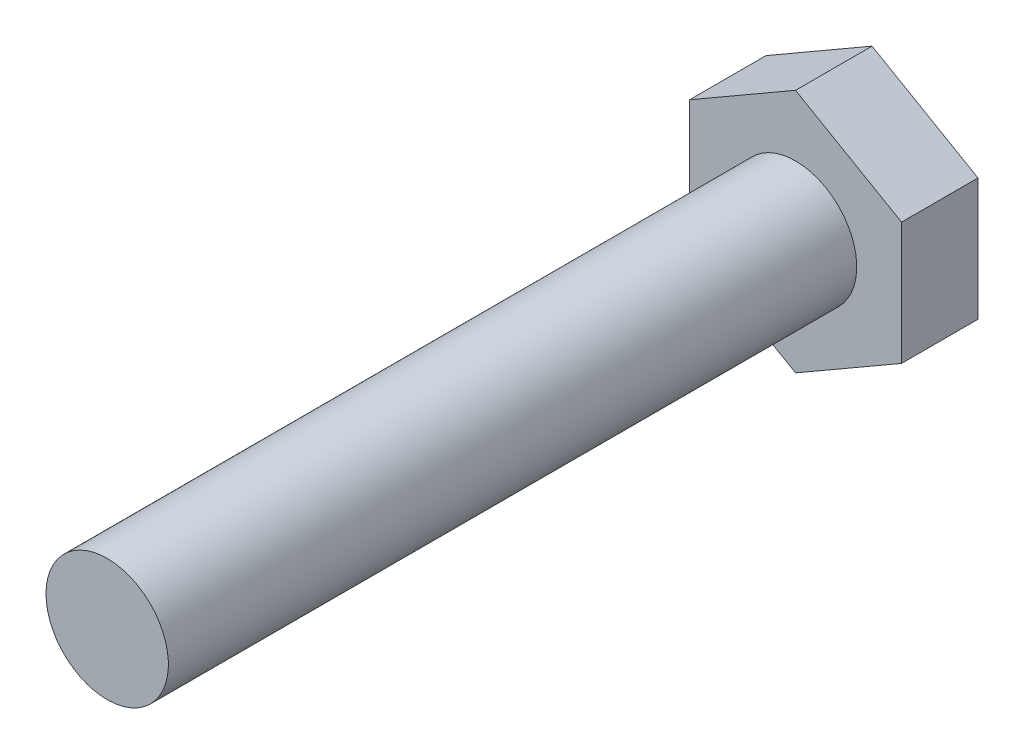
ISO-10303-21;
HEADER;
FILE_DESCRIPTION(('STEP AP214'),'2;1');
FILE_NAME('part.step','',(''),(''),'','','');
FILE_SCHEMA(('AUTOMOTIVE_DESIGN { 1 0 10303 214 1 1 1 1 }'));
ENDSEC;
DATA;
#1=APPLICATION_CONTEXT('core data for automotive mechanical design processes');
#2=APPLICATION_PROTOCOL_DEFINITION('international standard','automotive_design',2000,#1);
#3=PRODUCT_CONTEXT('',#1,'mechanical');
#4=PRODUCT('Part','Part','',(#3));
#5=PRODUCT_RELATED_PRODUCT_CATEGORY('part','',(#4));
#6=PRODUCT_DEFINITION_FORMATION('','',#4);
#7=PRODUCT_DEFINITION_CONTEXT('part definition',#1,'design');
#8=PRODUCT_DEFINITION('design','',#6,#7);
#9=PRODUCT_DEFINITION_SHAPE('','',#8);
#10=(LENGTH_UNIT() NAMED_UNIT(*) SI_UNIT(.MILLI.,.METRE.));
#11=(NAMED_UNIT(*) PLANE_ANGLE_UNIT() SI_UNIT($,.RADIAN.));
#12=(NAMED_UNIT(*) SI_UNIT($,.STERADIAN.) SOLID_ANGLE_UNIT());
#13=UNCERTAINTY_MEASURE_WITH_UNIT(LENGTH_MEASURE(1.E-05),#10,'distance_accuracy_value','');
#14=(GEOMETRIC_REPRESENTATION_CONTEXT(3) GLOBAL_UNCERTAINTY_ASSIGNED_CONTEXT((#13)) GLOBAL_UNIT_ASSIGNED_CONTEXT((#10,
#11,#12)) REPRESENTATION_CONTEXT('',''));
#15=CARTESIAN_POINT('',(0.,0.,0.));
#16=DIRECTION('',(0.,0.,1.));
#17=DIRECTION('',(1.,0.,0.));
#18=AXIS2_PLACEMENT_3D('',#15,#16,#17);
#19=CARTESIAN_POINT('',(13.856406460551,-8.,10.));
#20=DIRECTION('',(-1.,0.,0.));
#21=DIRECTION('',(0.,-1.,0.));
#22=AXIS2_PLACEMENT_3D('',#19,#20,#21);
#23=PLANE('',#22);
#24=DIRECTION('',(0.,1.,0.));
#25=VECTOR('',#24,1.);
#26=CARTESIAN_POINT('',(13.856406460551,-8.,0.));
#27=LINE('',#26,#25);
#28=CARTESIAN_POINT('',(13.856406460551,-8.,0.));
#29=VERTEX_POINT('',#28);
#30=CARTESIAN_POINT('',(13.856406460551,8.00000000000001,0.));
#31=VERTEX_POINT('',#30);
#32=EDGE_CURVE('E123',#29,#31,#27,.T.);
#33=ORIENTED_EDGE('',*,*,#32,.T.);
#34=DIRECTION('',(0.,0.,-1.));
#35=VECTOR('',#34,1.);
#36=CARTESIAN_POINT('',(13.856406460551,8.00000000000001,10.));
#37=LINE('',#36,#35);
#38=CARTESIAN_POINT('',(13.856406460551,8.00000000000001,10.));
#39=VERTEX_POINT('',#38);
#40=EDGE_CURVE('E40',#39,#31,#37,.T.);
#41=ORIENTED_EDGE('',*,*,#40,.F.);
#42=DIRECTION('',(0.,1.,0.));
#43=VECTOR('',#42,1.);
#44=CARTESIAN_POINT('',(13.856406460551,-8.,10.));
#45=LINE('',#44,#43);
#46=CARTESIAN_POINT('',(13.856406460551,-8.,10.));
#47=VERTEX_POINT('',#46);
#48=EDGE_CURVE('E134',#47,#39,#45,.T.);
#49=ORIENTED_EDGE('',*,*,#48,.F.);
#50=DIRECTION('',(0.,0.,-1.));
#51=VECTOR('',#50,1.);
#52=CARTESIAN_POINT('',(13.856406460551,-8.,10.));
#53=LINE('',#52,#51);
#54=EDGE_CURVE('E119',#47,#29,#53,.T.);
#55=ORIENTED_EDGE('',*,*,#54,.T.);
#56=EDGE_LOOP('',(#33,#41,#49,#55));
#57=FACE_BOUND('',#56,.T.);
#58=ADVANCED_FACE('F37',(#57),#23,.F.);
#59=CARTESIAN_POINT('',(13.856406460551,8.00000000000001,10.));
#60=DIRECTION('',(-0.5,-0.866025403784439,0.));
#61=DIRECTION('',(0.866025403784439,-0.5,0.));
#62=AXIS2_PLACEMENT_3D('',#59,#60,#61);
#63=PLANE('',#62);
#64=DIRECTION('',(-0.866025403784439,0.5,0.));
#65=VECTOR('',#64,1.);
#66=CARTESIAN_POINT('',(13.856406460551,8.00000000000001,0.));
#67=LINE('',#66,#65);
#68=CARTESIAN_POINT('',(0.,16.,0.));
#69=VERTEX_POINT('',#68);
#70=EDGE_CURVE('E126',#31,#69,#67,.T.);
#71=ORIENTED_EDGE('',*,*,#70,.T.);
#72=DIRECTION('',(0.,0.,-1.));
#73=VECTOR('',#72,1.);
#74=CARTESIAN_POINT('',(0.,16.,10.));
#75=LINE('',#74,#73);
#76=CARTESIAN_POINT('',(0.,16.,10.));
#77=VERTEX_POINT('',#76);
#78=EDGE_CURVE('E137',#77,#69,#75,.T.);
#79=ORIENTED_EDGE('',*,*,#78,.F.);
#80=DIRECTION('',(-0.866025403784439,0.5,0.));
#81=VECTOR('',#80,1.);
#82=CARTESIAN_POINT('',(13.856406460551,8.00000000000001,10.));
#83=LINE('',#82,#81);
#84=EDGE_CURVE('E92',#39,#77,#83,.T.);
#85=ORIENTED_EDGE('',*,*,#84,.F.);
#86=ORIENTED_EDGE('',*,*,#40,.T.);
#87=EDGE_LOOP('',(#71,#79,#85,#86));
#88=FACE_BOUND('',#87,.T.);
#89=ADVANCED_FACE('F142',(#88),#63,.F.);
#90=CARTESIAN_POINT('',(0.,16.,10.));
#91=DIRECTION('',(0.5,-0.866025403784439,0.));
#92=DIRECTION('',(0.866025403784439,0.5,0.));
#93=AXIS2_PLACEMENT_3D('',#90,#91,#92);
#94=PLANE('',#93);
#95=DIRECTION('',(-0.866025403784439,-0.5,0.));
#96=VECTOR('',#95,1.);
#97=CARTESIAN_POINT('',(0.,16.,0.));
#98=LINE('',#97,#96);
#99=CARTESIAN_POINT('',(-13.856406460551,8.,0.));
#100=VERTEX_POINT('',#99);
#101=EDGE_CURVE('E129',#69,#100,#98,.T.);
#102=ORIENTED_EDGE('',*,*,#101,.T.);
#103=DIRECTION('',(0.,0.,-1.));
#104=VECTOR('',#103,1.);
#105=CARTESIAN_POINT('',(-13.856406460551,8.,10.));
#106=LINE('',#105,#104);
#107=CARTESIAN_POINT('',(-13.856406460551,8.,10.));
#108=VERTEX_POINT('',#107);
#109=EDGE_CURVE('E114',#108,#100,#106,.T.);
#110=ORIENTED_EDGE('',*,*,#109,.F.);
#111=DIRECTION('',(-0.866025403784439,-0.5,0.));
#112=VECTOR('',#111,1.);
#113=CARTESIAN_POINT('',(0.,16.,10.));
#114=LINE('',#113,#112);
#115=EDGE_CURVE('E105',#77,#108,#114,.T.);
#116=ORIENTED_EDGE('',*,*,#115,.F.);
#117=ORIENTED_EDGE('',*,*,#78,.T.);
#118=EDGE_LOOP('',(#102,#110,#116,#117));
#119=FACE_BOUND('',#118,.T.);
#120=ADVANCED_FACE('F148',(#119),#94,.F.);
#121=CARTESIAN_POINT('',(-13.856406460551,8.,10.));
#122=DIRECTION('',(1.,0.,0.));
#123=DIRECTION('',(0.,0.,-1.));
#124=AXIS2_PLACEMENT_3D('',#121,#122,#123);
#125=PLANE('',#124);
#126=DIRECTION('',(0.,-1.,0.));
#127=VECTOR('',#126,1.);
#128=CARTESIAN_POINT('',(-13.856406460551,8.,0.));
#129=LINE('',#128,#127);
#130=CARTESIAN_POINT('',(-13.856406460551,-8.,0.));
#131=VERTEX_POINT('',#130);
#132=EDGE_CURVE('E113',#100,#131,#129,.T.);
#133=ORIENTED_EDGE('',*,*,#132,.T.);
#134=DIRECTION('',(0.,0.,-1.));
#135=VECTOR('',#134,1.);
#136=CARTESIAN_POINT('',(-13.856406460551,-8.,10.));
#137=LINE('',#136,#135);
#138=CARTESIAN_POINT('',(-13.856406460551,-8.,10.));
#139=VERTEX_POINT('',#138);
#140=EDGE_CURVE('E110',#139,#131,#137,.T.);
#141=ORIENTED_EDGE('',*,*,#140,.F.);
#142=DIRECTION('',(0.,-1.,0.));
#143=VECTOR('',#142,1.);
#144=CARTESIAN_POINT('',(-13.856406460551,8.,10.));
#145=LINE('',#144,#143);
#146=EDGE_CURVE('E99',#108,#139,#145,.T.);
#147=ORIENTED_EDGE('',*,*,#146,.F.);
#148=ORIENTED_EDGE('',*,*,#109,.T.);
#149=EDGE_LOOP('',(#133,#141,#147,#148));
#150=FACE_BOUND('',#149,.T.);
#151=ADVANCED_FACE('F111',(#150),#125,.F.);
#152=CARTESIAN_POINT('',(-13.856406460551,-8.,10.));
#153=DIRECTION('',(0.5,0.866025403784439,0.));
#154=DIRECTION('',(-0.866025403784439,0.5,0.));
#155=AXIS2_PLACEMENT_3D('',#152,#153,#154);
#156=PLANE('',#155);
#157=DIRECTION('',(0.866025403784439,-0.5,0.));
#158=VECTOR('',#157,1.);
#159=CARTESIAN_POINT('',(-13.856406460551,-8.,0.));
#160=LINE('',#159,#158);
#161=CARTESIAN_POINT('',(0.,-16.,0.));
#162=VERTEX_POINT('',#161);
#163=EDGE_CURVE('E77',#131,#162,#160,.T.);
#164=ORIENTED_EDGE('',*,*,#163,.T.);
#165=DIRECTION('',(0.,0.,-1.));
#166=VECTOR('',#165,1.);
#167=CARTESIAN_POINT('',(0.,-16.,10.));
#168=LINE('',#167,#166);
#169=CARTESIAN_POINT('',(0.,-16.,10.));
#170=VERTEX_POINT('',#169);
#171=EDGE_CURVE('E115',#170,#162,#168,.T.);
#172=ORIENTED_EDGE('',*,*,#171,.F.);
#173=DIRECTION('',(0.866025403784439,-0.5,0.));
#174=VECTOR('',#173,1.);
#175=CARTESIAN_POINT('',(-13.856406460551,-8.,10.));
#176=LINE('',#175,#174);
#177=EDGE_CURVE('E103',#139,#170,#176,.T.);
#178=ORIENTED_EDGE('',*,*,#177,.F.);
#179=ORIENTED_EDGE('',*,*,#140,.T.);
#180=EDGE_LOOP('',(#164,#172,#178,#179));
#181=FACE_BOUND('',#180,.T.);
#182=ADVANCED_FACE('F117',(#181),#156,.F.);
#183=CARTESIAN_POINT('',(0.,-16.,10.));
#184=DIRECTION('',(-0.5,0.866025403784439,0.));
#185=DIRECTION('',(-0.866025403784439,-0.5,0.));
#186=AXIS2_PLACEMENT_3D('',#183,#184,#185);
#187=PLANE('',#186);
#188=DIRECTION('',(0.866025403784439,0.5,0.));
#189=VECTOR('',#188,1.);
#190=CARTESIAN_POINT('',(0.,-16.,0.));
#191=LINE('',#190,#189);
#192=EDGE_CURVE('E83',#162,#29,#191,.T.);
#193=ORIENTED_EDGE('',*,*,#192,.T.);
#194=ORIENTED_EDGE('',*,*,#54,.F.);
#195=DIRECTION('',(0.866025403784439,0.5,0.));
#196=VECTOR('',#195,1.);
#197=CARTESIAN_POINT('',(0.,-16.,10.));
#198=LINE('',#197,#196);
#199=EDGE_CURVE('E54',#170,#47,#198,.T.);
#200=ORIENTED_EDGE('',*,*,#199,.F.);
#201=ORIENTED_EDGE('',*,*,#171,.T.);
#202=EDGE_LOOP('',(#193,#194,#200,#201));
#203=FACE_BOUND('',#202,.T.);
#204=ADVANCED_FACE('F164',(#203),#187,.F.);
#205=CARTESIAN_POINT('',(0.,0.,10.));
#206=DIRECTION('',(0.,0.,1.));
#207=DIRECTION('',(1.,0.,0.));
#208=AXIS2_PLACEMENT_3D('',#205,#206,#207);
#209=PLANE('',#208);
#210=CARTESIAN_POINT('',(0.,0.,10.));
#211=DIRECTION('',(0.,0.,1.));
#212=DIRECTION('',(1.,0.,0.));
#213=AXIS2_PLACEMENT_3D('',#210,#211,#212);
#214=CIRCLE('',#213,8.);
#215=CARTESIAN_POINT('',(-8.,0.,10.));
#216=VERTEX_POINT('',#215);
#217=EDGE_CURVE('E11',#216,#216,#214,.T.);
#218=ORIENTED_EDGE('',*,*,#217,.F.);
#219=EDGE_LOOP('',(#218));
#220=FACE_BOUND('',#219,.T.);
#221=ORIENTED_EDGE('',*,*,#48,.T.);
#222=ORIENTED_EDGE('',*,*,#84,.T.);
#223=ORIENTED_EDGE('',*,*,#115,.T.);
#224=ORIENTED_EDGE('',*,*,#146,.T.);
#225=ORIENTED_EDGE('',*,*,#177,.T.);
#226=ORIENTED_EDGE('',*,*,#199,.T.);
#227=EDGE_LOOP('',(#221,#222,#223,#224,#225,#226));
#228=FACE_BOUND('',#227,.T.);
#229=ADVANCED_FACE('F101',(#220,#228),#209,.T.);
#230=CARTESIAN_POINT('',(0.,0.,0.));
#231=DIRECTION('',(0.,0.,1.));
#232=DIRECTION('',(1.,0.,0.));
#233=AXIS2_PLACEMENT_3D('',#230,#231,#232);
#234=PLANE('',#233);
#235=ORIENTED_EDGE('',*,*,#32,.F.);
#236=ORIENTED_EDGE('',*,*,#192,.F.);
#237=ORIENTED_EDGE('',*,*,#163,.F.);
#238=ORIENTED_EDGE('',*,*,#132,.F.);
#239=ORIENTED_EDGE('',*,*,#101,.F.);
#240=ORIENTED_EDGE('',*,*,#70,.F.);
#241=EDGE_LOOP('',(#235,#236,#237,#238,#239,#240));
#242=FACE_BOUND('',#241,.T.);
#243=ADVANCED_FACE('F147',(#242),#234,.F.);
#244=CARTESIAN_POINT('',(0.,0.,100.));
#245=DIRECTION('',(0.,0.,-1.));
#246=DIRECTION('',(-1.,0.,0.));
#247=AXIS2_PLACEMENT_3D('',#244,#245,#246);
#248=CYLINDRICAL_SURFACE('',#247,8.);
#249=CARTESIAN_POINT('',(0.,0.,100.));
#250=DIRECTION('',(0.,0.,1.));
#251=DIRECTION('',(1.,0.,0.));
#252=AXIS2_PLACEMENT_3D('',#249,#250,#251);
#253=CIRCLE('',#252,8.);
#254=CARTESIAN_POINT('',(-8.,0.,100.));
#255=VERTEX_POINT('',#254);
#256=EDGE_CURVE('E127',#255,#255,#253,.T.);
#257=CARTESIAN_POINT('',(-8.,0.,100.));
#258=CARTESIAN_POINT('',(-8.,0.,99.0625));
#259=CARTESIAN_POINT('',(-8.,0.,98.125));
#260=CARTESIAN_POINT('',(-8.,0.,96.25));
#261=CARTESIAN_POINT('',(-8.,0.,95.3125));
#262=CARTESIAN_POINT('',(-8.,0.,93.4375));
#263=CARTESIAN_POINT('',(-8.,0.,92.5));
#264=CARTESIAN_POINT('',(-8.,0.,90.625));
#265=CARTESIAN_POINT('',(-8.,0.,89.6875));
#266=CARTESIAN_POINT('',(-8.,0.,87.8125));
#267=CARTESIAN_POINT('',(-8.,0.,86.875));
#268=CARTESIAN_POINT('',(-8.,0.,85.));
#269=CARTESIAN_POINT('',(-8.,0.,84.0625));
#270=CARTESIAN_POINT('',(-8.,0.,82.1875));
#271=CARTESIAN_POINT('',(-8.,0.,81.25));
#272=CARTESIAN_POINT('',(-8.,0.,79.375));
#273=CARTESIAN_POINT('',(-8.,0.,78.4375));
#274=CARTESIAN_POINT('',(-8.,0.,76.5625));
#275=CARTESIAN_POINT('',(-8.,0.,75.625));
#276=CARTESIAN_POINT('',(-8.,0.,73.75));
#277=CARTESIAN_POINT('',(-8.,0.,72.8125));
#278=CARTESIAN_POINT('',(-8.,0.,70.9375));
#279=CARTESIAN_POINT('',(-8.,0.,70.));
#280=CARTESIAN_POINT('',(-8.,0.,68.125));
#281=CARTESIAN_POINT('',(-8.,0.,67.1875));
#282=CARTESIAN_POINT('',(-8.,0.,65.3125));
#283=CARTESIAN_POINT('',(-8.,0.,64.375));
#284=CARTESIAN_POINT('',(-8.,0.,62.5));
#285=CARTESIAN_POINT('',(-8.,0.,61.5625));
#286=CARTESIAN_POINT('',(-8.,0.,59.6875));
#287=CARTESIAN_POINT('',(-8.,0.,58.75));
#288=CARTESIAN_POINT('',(-8.,0.,56.875));
#289=CARTESIAN_POINT('',(-8.,0.,55.9375));
#290=CARTESIAN_POINT('',(-8.,0.,54.0625));
#291=CARTESIAN_POINT('',(-8.,0.,53.125));
#292=CARTESIAN_POINT('',(-8.,0.,51.25));
#293=CARTESIAN_POINT('',(-8.,0.,50.3125));
#294=CARTESIAN_POINT('',(-8.,0.,48.4375));
#295=CARTESIAN_POINT('',(-8.,0.,47.5));
#296=CARTESIAN_POINT('',(-8.,0.,45.625));
#297=CARTESIAN_POINT('',(-8.,0.,44.6875));
#298=CARTESIAN_POINT('',(-8.,0.,42.8125));
#299=CARTESIAN_POINT('',(-8.,0.,41.875));
#300=CARTESIAN_POINT('',(-8.,0.,40.));
#301=CARTESIAN_POINT('',(-8.,0.,39.0625));
#302=CARTESIAN_POINT('',(-8.,0.,37.1875));
#303=CARTESIAN_POINT('',(-8.,0.,36.25));
#304=CARTESIAN_POINT('',(-8.,0.,34.375));
#305=CARTESIAN_POINT('',(-8.,0.,33.4375));
#306=CARTESIAN_POINT('',(-8.,0.,31.5625));
#307=CARTESIAN_POINT('',(-8.,0.,30.625));
#308=CARTESIAN_POINT('',(-8.,0.,28.75));
#309=CARTESIAN_POINT('',(-8.,0.,27.8125));
#310=CARTESIAN_POINT('',(-8.,0.,25.9375));
#311=CARTESIAN_POINT('',(-8.,0.,25.));
#312=CARTESIAN_POINT('',(-8.,0.,23.125));
#313=CARTESIAN_POINT('',(-8.,0.,22.1875));
#314=CARTESIAN_POINT('',(-8.,0.,20.3125));
#315=CARTESIAN_POINT('',(-8.,0.,19.375));
#316=CARTESIAN_POINT('',(-8.,0.,17.5));
#317=CARTESIAN_POINT('',(-8.,0.,16.5625));
#318=CARTESIAN_POINT('',(-8.,0.,14.6875));
#319=CARTESIAN_POINT('',(-8.,0.,13.75));
#320=CARTESIAN_POINT('',(-8.,0.,11.875));
#321=CARTESIAN_POINT('',(-8.,0.,10.9375));
#322=CARTESIAN_POINT('',(-8.,0.,10.));
#323=B_SPLINE_CURVE_WITH_KNOTS('',3,(#257,#258,#259,#260,#261,#262,#263,#264,#265,#266,#267,
#268,#269,#270,#271,#272,#273,#274,#275,#276,#277,#278,#279,#280,#281,#282,#283,#284,#285,#286,
#287,#288,#289,#290,#291,#292,#293,#294,#295,#296,#297,#298,#299,#300,#301,#302,#303,#304,#305,
#306,#307,#308,#309,#310,#311,#312,#313,#314,#315,#316,#317,#318,#319,#320,#321,#322),
.UNSPECIFIED.,.F.,.F.,(4,2,2,2,2,2,2,2,2,2,2,2,2,2,2,2,2,2,2,2,2,2,2,2,2,2,2,2,2,2,2,2,4),(0.,
2.8125,5.62499999999999,8.43749999999999,11.25,14.0625,16.875,19.6875,22.5,25.3125,28.125,
30.9375,33.75,36.5625,39.375,42.1875,45.,47.8125,50.625,53.4375,56.25,59.0625,61.875,64.6875,
67.5,70.3125,73.125,75.9375,78.75,81.5625,84.375,87.1875,90.),.UNSPECIFIED.);
#324=EDGE_CURVE('BSEAM157',#255,#216,#323,.T.);
#325=ORIENTED_EDGE('',*,*,#256,.F.);
#326=ORIENTED_EDGE('',*,*,#217,.T.);
#327=ORIENTED_EDGE('',*,*,#324,.T.);
#328=ORIENTED_EDGE('',*,*,#324,.F.);
#329=EDGE_LOOP('',(#325,#327,#326,#328));
#330=FACE_BOUND('',#329,.T.);
#331=ADVANCED_FACE('F157',(#330),#248,.T.);
#332=CARTESIAN_POINT('',(0.,0.,100.));
#333=DIRECTION('',(0.,0.,1.));
#334=DIRECTION('',(1.,0.,0.));
#335=AXIS2_PLACEMENT_3D('',#332,#333,#334);
#336=PLANE('',#335);
#337=ORIENTED_EDGE('',*,*,#256,.T.);
#338=EDGE_LOOP('',(#337));
#339=FACE_BOUND('',#338,.T.);
#340=ADVANCED_FACE('F155',(#339),#336,.T.);
#341=CLOSED_SHELL('',(#58,#89,#120,#151,#182,#204,#229,#243,#331,#340));
#342=MANIFOLD_SOLID_BREP('B2',#341);
#343=ADVANCED_BREP_SHAPE_REPRESENTATION('',(#18,#342),#14);
#344=SHAPE_DEFINITION_REPRESENTATION(#9,#343);
ENDSEC;
END-ISO-10303-21;
